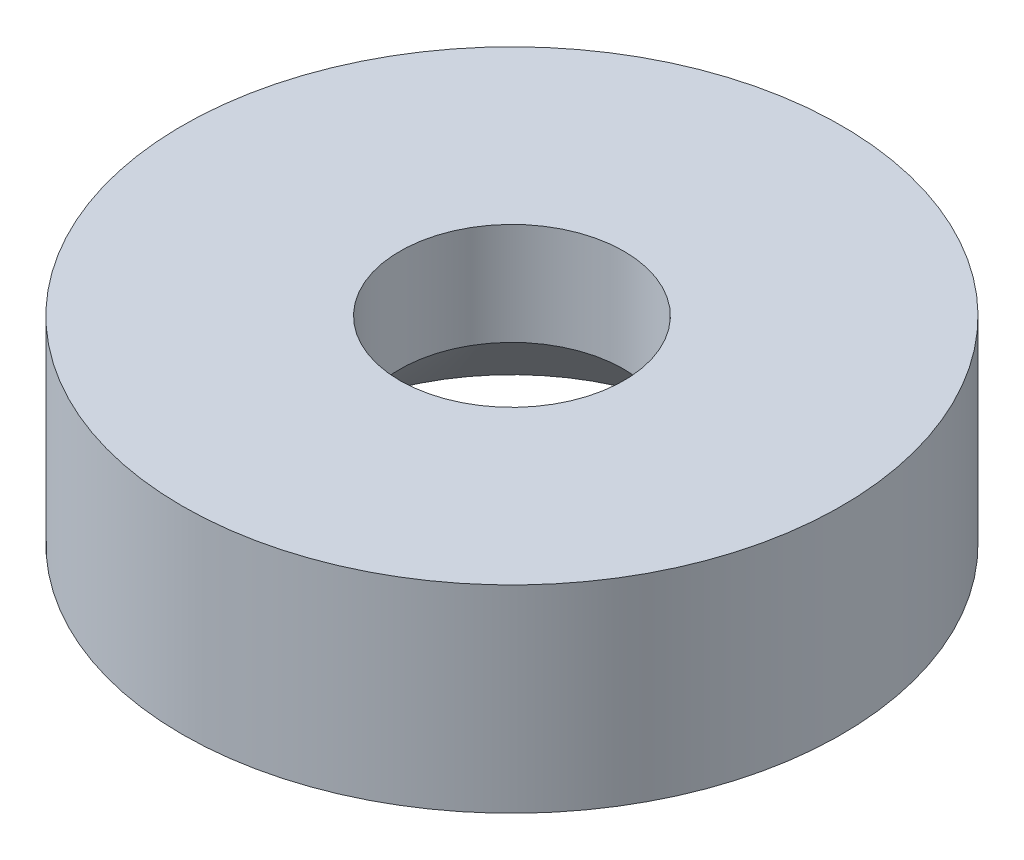
ISO-10303-21;
HEADER;
FILE_DESCRIPTION(('STEP AP214'),'2;1');
FILE_NAME('part.step','',(''),(''),'','','');
FILE_SCHEMA(('AUTOMOTIVE_DESIGN { 1 0 10303 214 1 1 1 1 }'));
ENDSEC;
DATA;
#1=APPLICATION_CONTEXT('core data for automotive mechanical design processes');
#2=APPLICATION_PROTOCOL_DEFINITION('international standard','automotive_design',2000,#1);
#3=PRODUCT_CONTEXT('',#1,'mechanical');
#4=PRODUCT('Part','Part','',(#3));
#5=PRODUCT_RELATED_PRODUCT_CATEGORY('part','',(#4));
#6=PRODUCT_DEFINITION_FORMATION('','',#4);
#7=PRODUCT_DEFINITION_CONTEXT('part definition',#1,'design');
#8=PRODUCT_DEFINITION('design','',#6,#7);
#9=PRODUCT_DEFINITION_SHAPE('','',#8);
#10=(LENGTH_UNIT() NAMED_UNIT(*) SI_UNIT(.MILLI.,.METRE.));
#11=(NAMED_UNIT(*) PLANE_ANGLE_UNIT() SI_UNIT($,.RADIAN.));
#12=(NAMED_UNIT(*) SI_UNIT($,.STERADIAN.) SOLID_ANGLE_UNIT());
#13=UNCERTAINTY_MEASURE_WITH_UNIT(LENGTH_MEASURE(1.E-05),#10,'distance_accuracy_value','');
#14=(GEOMETRIC_REPRESENTATION_CONTEXT(3) GLOBAL_UNCERTAINTY_ASSIGNED_CONTEXT((#13)) GLOBAL_UNIT_ASSIGNED_CONTEXT((#10,
#11,#12)) REPRESENTATION_CONTEXT('',''));
#15=CARTESIAN_POINT('',(0.,0.,0.));
#16=DIRECTION('',(0.,0.,1.));
#17=DIRECTION('',(1.,0.,0.));
#18=AXIS2_PLACEMENT_3D('',#15,#16,#17);
#19=CARTESIAN_POINT('',(0.475848056421146,3.,0.924139707144431));
#20=DIRECTION('',(0.,-1.,0.));
#21=DIRECTION('',(0.,0.,-1.));
#22=AXIS2_PLACEMENT_3D('',#19,#20,#21);
#23=CYLINDRICAL_SURFACE('',#22,5.);
#24=CARTESIAN_POINT('',(0.475848056421146,3.,0.924139707144431));
#25=DIRECTION('',(0.,1.,0.));
#26=DIRECTION('',(0.,0.,1.));
#27=AXIS2_PLACEMENT_3D('',#24,#25,#26);
#28=CIRCLE('',#27,5.);
#29=CARTESIAN_POINT('',(0.475848056421158,3.,5.92413970714443));
#30=VERTEX_POINT('',#29);
#31=EDGE_CURVE('E12',#30,#30,#28,.T.);
#32=ORIENTED_EDGE('',*,*,#31,.F.);
#33=EDGE_LOOP('',(#32));
#34=FACE_BOUND('',#33,.T.);
#35=CARTESIAN_POINT('',(0.475848056421146,0.,0.924139707144431));
#36=DIRECTION('',(0.,1.,0.));
#37=DIRECTION('',(0.,0.,1.));
#38=AXIS2_PLACEMENT_3D('',#35,#36,#37);
#39=CIRCLE('',#38,5.);
#40=CARTESIAN_POINT('',(0.475848056421158,0.,5.92413970714443));
#41=VERTEX_POINT('',#40);
#42=EDGE_CURVE('E45',#41,#41,#39,.T.);
#43=ORIENTED_EDGE('',*,*,#42,.T.);
#44=EDGE_LOOP('',(#43));
#45=FACE_BOUND('',#44,.T.);
#46=ADVANCED_FACE('F42',(#34,#45),#23,.T.);
#47=CARTESIAN_POINT('',(0.475848056421146,3.,0.924139707144431));
#48=DIRECTION('',(0.,1.,0.));
#49=DIRECTION('',(0.,0.,1.));
#50=AXIS2_PLACEMENT_3D('',#47,#48,#49);
#51=PLANE('',#50);
#52=CARTESIAN_POINT('',(0.475848056421146,3.,0.924139707144431));
#53=DIRECTION('',(0.,-1.,0.));
#54=DIRECTION('',(0.,0.,-1.));
#55=AXIS2_PLACEMENT_3D('',#52,#53,#54);
#56=CIRCLE('',#55,1.7);
#57=CARTESIAN_POINT('',(0.475848056421143,3.,-0.775860292855569));
#58=VERTEX_POINT('',#57);
#59=EDGE_CURVE('E52',#58,#58,#56,.T.);
#60=ORIENTED_EDGE('',*,*,#59,.T.);
#61=EDGE_LOOP('',(#60));
#62=FACE_BOUND('',#61,.T.);
#63=ORIENTED_EDGE('',*,*,#31,.T.);
#64=EDGE_LOOP('',(#63));
#65=FACE_BOUND('',#64,.T.);
#66=ADVANCED_FACE('F69',(#62,#65),#51,.T.);
#67=CARTESIAN_POINT('',(0.475848056421146,0.,0.924139707144431));
#68=DIRECTION('',(0.,1.,0.));
#69=DIRECTION('',(0.,0.,1.));
#70=AXIS2_PLACEMENT_3D('',#67,#68,#69);
#71=PLANE('',#70);
#72=CARTESIAN_POINT('',(0.475848056421146,0.,0.924139707144431));
#73=DIRECTION('',(0.,-1.,0.));
#74=DIRECTION('',(0.,0.,-1.));
#75=AXIS2_PLACEMENT_3D('',#72,#73,#74);
#76=CIRCLE('',#75,3.15);
#77=CARTESIAN_POINT('',(0.475848056421139,0.,-2.22586029285557));
#78=VERTEX_POINT('',#77);
#79=EDGE_CURVE('E59',#78,#78,#76,.T.);
#80=ORIENTED_EDGE('',*,*,#79,.F.);
#81=EDGE_LOOP('',(#80));
#82=FACE_BOUND('',#81,.T.);
#83=ORIENTED_EDGE('',*,*,#42,.F.);
#84=EDGE_LOOP('',(#83));
#85=FACE_BOUND('',#84,.T.);
#86=ADVANCED_FACE('F65',(#82,#85),#71,.F.);
#87=CARTESIAN_POINT('',(0.475848056421146,0.,0.924139707144431));
#88=DIRECTION('',(0.,-1.,0.));
#89=DIRECTION('',(0.,0.,-1.));
#90=AXIS2_PLACEMENT_3D('',#87,#88,#89);
#91=CYLINDRICAL_SURFACE('',#90,1.7);
#92=ORIENTED_EDGE('',*,*,#59,.F.);
#93=EDGE_LOOP('',(#92));
#94=FACE_BOUND('',#93,.T.);
#95=CARTESIAN_POINT('',(0.475848056421146,1.45000000000001,0.924139707144431));
#96=DIRECTION('',(0.,-1.,0.));
#97=DIRECTION('',(0.,0.,-1.));
#98=AXIS2_PLACEMENT_3D('',#95,#96,#97);
#99=CIRCLE('',#98,1.7);
#100=CARTESIAN_POINT('',(0.475848056421143,1.45000000000001,-0.775860292855569));
#101=VERTEX_POINT('',#100);
#102=EDGE_CURVE('E56',#101,#101,#99,.T.);
#103=ORIENTED_EDGE('',*,*,#102,.T.);
#104=EDGE_LOOP('',(#103));
#105=FACE_BOUND('',#104,.T.);
#106=ADVANCED_FACE('F68',(#94,#105),#91,.F.);
#107=CARTESIAN_POINT('',(0.475848056421146,0.,0.924139707144431));
#108=DIRECTION('',(0.,-1.,0.));
#109=DIRECTION('',(0.,0.,-1.));
#110=AXIS2_PLACEMENT_3D('',#107,#108,#109);
#111=CONICAL_SURFACE('',#110,3.15,0.785398163397448);
#112=ORIENTED_EDGE('',*,*,#102,.F.);
#113=EDGE_LOOP('',(#112));
#114=FACE_BOUND('',#113,.T.);
#115=ORIENTED_EDGE('',*,*,#79,.T.);
#116=EDGE_LOOP('',(#115));
#117=FACE_BOUND('',#116,.T.);
#118=ADVANCED_FACE('F63',(#114,#117),#111,.F.);
#119=CLOSED_SHELL('',(#46,#66,#86,#106,#118));
#120=MANIFOLD_SOLID_BREP('B2',#119);
#121=ADVANCED_BREP_SHAPE_REPRESENTATION('',(#18,#120),#14);
#122=SHAPE_DEFINITION_REPRESENTATION(#9,#121);
ENDSEC;
END-ISO-10303-21;
